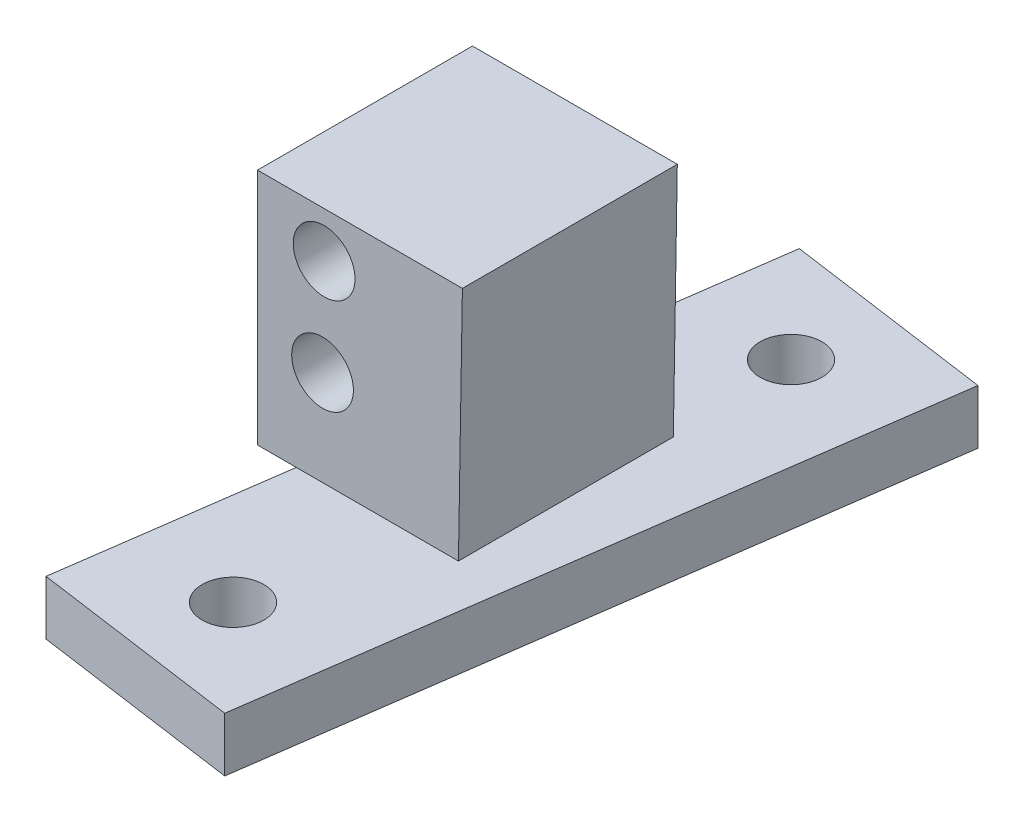
ISO-10303-21;
HEADER;
FILE_DESCRIPTION(('STEP AP214'),'2;1');
FILE_NAME('part.step','',(''),(''),'','','');
FILE_SCHEMA(('AUTOMOTIVE_DESIGN { 1 0 10303 214 1 1 1 1 }'));
ENDSEC;
DATA;
#1=APPLICATION_CONTEXT('core data for automotive mechanical design processes');
#2=APPLICATION_PROTOCOL_DEFINITION('international standard','automotive_design',2000,#1);
#3=PRODUCT_CONTEXT('',#1,'mechanical');
#4=PRODUCT('Part','Part','',(#3));
#5=PRODUCT_RELATED_PRODUCT_CATEGORY('part','',(#4));
#6=PRODUCT_DEFINITION_FORMATION('','',#4);
#7=PRODUCT_DEFINITION_CONTEXT('part definition',#1,'design');
#8=PRODUCT_DEFINITION('design','',#6,#7);
#9=PRODUCT_DEFINITION_SHAPE('','',#8);
#10=(LENGTH_UNIT() NAMED_UNIT(*) SI_UNIT(.MILLI.,.METRE.));
#11=(NAMED_UNIT(*) PLANE_ANGLE_UNIT() SI_UNIT($,.RADIAN.));
#12=(NAMED_UNIT(*) SI_UNIT($,.STERADIAN.) SOLID_ANGLE_UNIT());
#13=UNCERTAINTY_MEASURE_WITH_UNIT(LENGTH_MEASURE(1.E-05),#10,'distance_accuracy_value','');
#14=(GEOMETRIC_REPRESENTATION_CONTEXT(3) GLOBAL_UNCERTAINTY_ASSIGNED_CONTEXT((#13)) GLOBAL_UNIT_ASSIGNED_CONTEXT((#10,
#11,#12)) REPRESENTATION_CONTEXT('',''));
#15=CARTESIAN_POINT('',(0.,0.,0.));
#16=DIRECTION('',(0.,0.,1.));
#17=DIRECTION('',(1.,0.,0.));
#18=AXIS2_PLACEMENT_3D('',#15,#16,#17);
#19=CARTESIAN_POINT('',(0.,110.70207067776,54.397912950041));
#20=DIRECTION('',(0.,-1.,0.));
#21=DIRECTION('',(0.,0.,-1.));
#22=AXIS2_PLACEMENT_3D('',#19,#20,#21);
#23=PLANE('',#22);
#24=DIRECTION('',(-1.,0.,0.));
#25=VECTOR('',#24,1.);
#26=CARTESIAN_POINT('',(0.,110.70207067776,0.));
#27=LINE('',#26,#25);
#28=CARTESIAN_POINT('',(437.572544129131,110.70207067776,0.));
#29=VERTEX_POINT('',#28);
#30=CARTESIAN_POINT('',(430.481837090521,110.70207067776,0.));
#31=VERTEX_POINT('',#30);
#32=EDGE_CURVE('E120',#29,#31,#27,.T.);
#33=ORIENTED_EDGE('',*,*,#32,.F.);
#34=DIRECTION('',(-0.139173100960062,0.,0.990268068741571));
#35=VECTOR('',#34,1.);
#36=CARTESIAN_POINT('',(431.295573301546,110.70207067776,44.6629681748933));
#37=LINE('',#36,#35);
#38=CARTESIAN_POINT('',(434.466872763878,110.70207067776,22.0979999999998));
#39=VERTEX_POINT('',#38);
#40=EDGE_CURVE('E11',#29,#39,#37,.T.);
#41=ORIENTED_EDGE('',*,*,#40,.T.);
#42=DIRECTION('',(1.,0.,0.));
#43=VECTOR('',#42,1.);
#44=CARTESIAN_POINT('',(0.,110.70207067776,22.0979999999998));
#45=LINE('',#44,#43);
#46=CARTESIAN_POINT('',(430.481837090521,110.70207067776,22.0979999999998));
#47=VERTEX_POINT('',#46);
#48=EDGE_CURVE('E152',#47,#39,#45,.T.);
#49=ORIENTED_EDGE('',*,*,#48,.F.);
#50=DIRECTION('',(0.,0.,-1.));
#51=VECTOR('',#50,1.);
#52=CARTESIAN_POINT('',(430.481837090521,110.70207067776,54.397912950041));
#53=LINE('',#52,#51);
#54=EDGE_CURVE('E102',#47,#31,#53,.T.);
#55=ORIENTED_EDGE('',*,*,#54,.T.);
#56=EDGE_LOOP('',(#33,#41,#49,#55));
#57=FACE_BOUND('',#56,.T.);
#58=ADVANCED_FACE('F47',(#57),#23,.T.);
#59=CARTESIAN_POINT('',(0.,135.188251434978,54.397912950041));
#60=DIRECTION('',(0.,1.,0.));
#61=DIRECTION('',(0.,0.,1.));
#62=AXIS2_PLACEMENT_3D('',#59,#60,#61);
#63=PLANE('',#62);
#64=DIRECTION('',(-1.,0.,0.));
#65=VECTOR('',#64,1.);
#66=CARTESIAN_POINT('',(0.,135.188251434978,22.0979999999998));
#67=LINE('',#66,#65);
#68=CARTESIAN_POINT('',(451.546293611045,135.188251434978,22.0979999999998));
#69=VERTEX_POINT('',#68);
#70=CARTESIAN_POINT('',(430.481837090521,135.188251434978,22.0979999999998));
#71=VERTEX_POINT('',#70);
#72=EDGE_CURVE('E146',#69,#71,#67,.T.);
#73=ORIENTED_EDGE('',*,*,#72,.F.);
#74=DIRECTION('',(0.,0.,-1.));
#75=VECTOR('',#74,1.);
#76=CARTESIAN_POINT('',(451.546293611045,135.188251434978,54.397912950041));
#77=LINE('',#76,#75);
#78=CARTESIAN_POINT('',(451.546293611045,135.188251434978,0.));
#79=VERTEX_POINT('',#78);
#80=EDGE_CURVE('E103',#69,#79,#77,.T.);
#81=ORIENTED_EDGE('',*,*,#80,.T.);
#82=DIRECTION('',(1.,0.,0.));
#83=VECTOR('',#82,1.);
#84=CARTESIAN_POINT('',(0.,135.188251434978,0.));
#85=LINE('',#84,#83);
#86=CARTESIAN_POINT('',(430.481837090521,135.188251434978,0.));
#87=VERTEX_POINT('',#86);
#88=EDGE_CURVE('E106',#87,#79,#85,.T.);
#89=ORIENTED_EDGE('',*,*,#88,.F.);
#90=DIRECTION('',(0.,0.,-1.));
#91=VECTOR('',#90,1.);
#92=CARTESIAN_POINT('',(430.481837090521,135.188251434978,54.397912950041));
#93=LINE('',#92,#91);
#94=EDGE_CURVE('E93',#71,#87,#93,.T.);
#95=ORIENTED_EDGE('',*,*,#94,.F.);
#96=EDGE_LOOP('',(#73,#81,#89,#95));
#97=FACE_BOUND('',#96,.T.);
#98=ADVANCED_FACE('F107',(#97),#63,.T.);
#99=CARTESIAN_POINT('',(430.481837090521,0.,54.397912950041));
#100=DIRECTION('',(-1.,0.,0.));
#101=DIRECTION('',(0.,0.,1.));
#102=AXIS2_PLACEMENT_3D('',#99,#100,#101);
#103=PLANE('',#102);
#104=DIRECTION('',(0.,-1.,0.));
#105=VECTOR('',#104,1.);
#106=CARTESIAN_POINT('',(430.481837090521,0.,22.0979999999998));
#107=LINE('',#106,#105);
#108=EDGE_CURVE('E99',#71,#47,#107,.T.);
#109=ORIENTED_EDGE('',*,*,#108,.F.);
#110=ORIENTED_EDGE('',*,*,#94,.T.);
#111=DIRECTION('',(0.,1.,0.));
#112=VECTOR('',#111,1.);
#113=CARTESIAN_POINT('',(430.481837090521,0.,0.));
#114=LINE('',#113,#112);
#115=EDGE_CURVE('E98',#31,#87,#114,.T.);
#116=ORIENTED_EDGE('',*,*,#115,.F.);
#117=ORIENTED_EDGE('',*,*,#54,.F.);
#118=EDGE_LOOP('',(#109,#110,#116,#117));
#119=FACE_BOUND('',#118,.T.);
#120=ADVANCED_FACE('F95',(#119),#103,.T.);
#121=CARTESIAN_POINT('',(437.164813365978,120.500000000002,54.397912950041));
#122=DIRECTION('',(0.,0.,-1.));
#123=DIRECTION('',(-1.,0.,0.));
#124=AXIS2_PLACEMENT_3D('',#121,#122,#123);
#125=CYLINDRICAL_SURFACE('',#124,3.17500000000002);
#126=CARTESIAN_POINT('',(437.164813365978,120.500000000002,22.0979999999998));
#127=DIRECTION('',(0.,0.,-1.));
#128=DIRECTION('',(-1.,0.,0.));
#129=AXIS2_PLACEMENT_3D('',#126,#127,#128);
#130=CIRCLE('',#129,3.17500000000002);
#131=CARTESIAN_POINT('',(433.989813365978,120.500000000002,22.0979999999998));
#132=VERTEX_POINT('',#131);
#133=EDGE_CURVE('E142',#132,#132,#130,.T.);
#134=ORIENTED_EDGE('',*,*,#133,.F.);
#135=EDGE_LOOP('',(#134));
#136=FACE_BOUND('',#135,.T.);
#137=CARTESIAN_POINT('',(437.164813365978,120.500000000002,0.));
#138=DIRECTION('',(0.,0.,1.));
#139=DIRECTION('',(1.,0.,0.));
#140=AXIS2_PLACEMENT_3D('',#137,#138,#139);
#141=CIRCLE('',#140,3.17500000000002);
#142=CARTESIAN_POINT('',(440.339813365979,120.500000000002,0.));
#143=VERTEX_POINT('',#142);
#144=EDGE_CURVE('E123',#143,#143,#141,.T.);
#145=ORIENTED_EDGE('',*,*,#144,.F.);
#146=EDGE_LOOP('',(#145));
#147=FACE_BOUND('',#146,.T.);
#148=ADVANCED_FACE('F315',(#136,#147),#125,.F.);
#149=CARTESIAN_POINT('',(449.174121077904,-7.46907661315017,54.397912950041));
#150=DIRECTION('',(0.999861775722981,-0.0166261675706381,0.));
#151=DIRECTION('',(0.0166261675706381,0.999861775722981,0.));
#152=AXIS2_PLACEMENT_3D('',#149,#150,#151);
#153=PLANE('',#152);
#154=DIRECTION('',(0.0166261675706381,0.999861775722981,0.));
#155=VECTOR('',#154,1.);
#156=CARTESIAN_POINT('',(449.174121077904,-7.46907661315017,22.0979999999998));
#157=LINE('',#156,#155);
#158=CARTESIAN_POINT('',(451.13912598616,110.70207067776,22.0979999999999));
#159=VERTEX_POINT('',#158);
#160=EDGE_CURVE('E74',#159,#69,#157,.T.);
#161=ORIENTED_EDGE('',*,*,#160,.F.);
#162=DIRECTION('',(0.,0.,-1.));
#163=VECTOR('',#162,1.);
#164=CARTESIAN_POINT('',(451.13912598616,110.70207067776,54.397912950041));
#165=LINE('',#164,#163);
#166=CARTESIAN_POINT('',(451.13912598616,110.70207067776,0.));
#167=VERTEX_POINT('',#166);
#168=EDGE_CURVE('E114',#159,#167,#165,.T.);
#169=ORIENTED_EDGE('',*,*,#168,.T.);
#170=DIRECTION('',(-0.0166261675706381,-0.999861775722981,0.));
#171=VECTOR('',#170,1.);
#172=CARTESIAN_POINT('',(449.174121077904,-7.46907661315017,0.));
#173=LINE('',#172,#171);
#174=EDGE_CURVE('E113',#79,#167,#173,.T.);
#175=ORIENTED_EDGE('',*,*,#174,.F.);
#176=ORIENTED_EDGE('',*,*,#80,.F.);
#177=EDGE_LOOP('',(#161,#169,#175,#176));
#178=FACE_BOUND('',#177,.T.);
#179=ADVANCED_FACE('F164',(#178),#153,.T.);
#180=CARTESIAN_POINT('',(437.331098026262,130.500000000002,54.397912950041));
#181=DIRECTION('',(0.,0.,-1.));
#182=DIRECTION('',(-1.,0.,0.));
#183=AXIS2_PLACEMENT_3D('',#180,#181,#182);
#184=CYLINDRICAL_SURFACE('',#183,3.17499999999997);
#185=CARTESIAN_POINT('',(437.331098026262,130.500000000002,22.0979999999998));
#186=DIRECTION('',(0.,0.,-1.));
#187=DIRECTION('',(-1.,0.,0.));
#188=AXIS2_PLACEMENT_3D('',#185,#186,#187);
#189=CIRCLE('',#188,3.17499999999997);
#190=CARTESIAN_POINT('',(434.156098026262,130.500000000002,22.0979999999998));
#191=VERTEX_POINT('',#190);
#192=EDGE_CURVE('E51',#191,#191,#189,.T.);
#193=ORIENTED_EDGE('',*,*,#192,.F.);
#194=EDGE_LOOP('',(#193));
#195=FACE_BOUND('',#194,.T.);
#196=CARTESIAN_POINT('',(437.331098026262,130.500000000002,0.));
#197=DIRECTION('',(0.,0.,1.));
#198=DIRECTION('',(1.,0.,0.));
#199=AXIS2_PLACEMENT_3D('',#196,#197,#198);
#200=CIRCLE('',#199,3.17499999999997);
#201=CARTESIAN_POINT('',(440.506098026262,130.500000000002,0.));
#202=VERTEX_POINT('',#201);
#203=EDGE_CURVE('E129',#202,#202,#200,.T.);
#204=ORIENTED_EDGE('',*,*,#203,.F.);
#205=EDGE_LOOP('',(#204));
#206=FACE_BOUND('',#205,.T.);
#207=ADVANCED_FACE('F161',(#195,#206),#184,.F.);
#208=CARTESIAN_POINT('',(0.,0.,0.));
#209=DIRECTION('',(0.,0.,1.));
#210=DIRECTION('',(1.,0.,0.));
#211=AXIS2_PLACEMENT_3D('',#208,#209,#210);
#212=PLANE('',#211);
#213=ORIENTED_EDGE('',*,*,#88,.T.);
#214=ORIENTED_EDGE('',*,*,#174,.T.);
#215=EDGE_CURVE('E124',#167,#29,#27,.T.);
#216=ORIENTED_EDGE('',*,*,#215,.T.);
#217=ORIENTED_EDGE('',*,*,#32,.T.);
#218=ORIENTED_EDGE('',*,*,#115,.T.);
#219=EDGE_LOOP('',(#213,#214,#216,#217,#218));
#220=FACE_BOUND('',#219,.T.);
#221=ORIENTED_EDGE('',*,*,#144,.T.);
#222=EDGE_LOOP('',(#221));
#223=FACE_BOUND('',#222,.T.);
#224=ORIENTED_EDGE('',*,*,#203,.T.);
#225=EDGE_LOOP('',(#224));
#226=FACE_BOUND('',#225,.T.);
#227=ADVANCED_FACE('F116',(#220,#223,#226),#212,.F.);
#228=CARTESIAN_POINT('',(405.259993131351,116.453404428401,22.0979999999998));
#229=DIRECTION('',(0.,0.,-1.));
#230=DIRECTION('',(-1.,0.,0.));
#231=AXIS2_PLACEMENT_3D('',#228,#229,#230);
#232=PLANE('',#231);
#233=ORIENTED_EDGE('',*,*,#133,.T.);
#234=EDGE_LOOP('',(#233));
#235=FACE_BOUND('',#234,.T.);
#236=ORIENTED_EDGE('',*,*,#72,.T.);
#237=ORIENTED_EDGE('',*,*,#108,.T.);
#238=ORIENTED_EDGE('',*,*,#48,.T.);
#239=EDGE_CURVE('E151',#39,#159,#45,.T.);
#240=ORIENTED_EDGE('',*,*,#239,.T.);
#241=ORIENTED_EDGE('',*,*,#160,.T.);
#242=EDGE_LOOP('',(#236,#237,#238,#240,#241));
#243=FACE_BOUND('',#242,.T.);
#244=ORIENTED_EDGE('',*,*,#192,.T.);
#245=EDGE_LOOP('',(#244));
#246=FACE_BOUND('',#245,.T.);
#247=ADVANCED_FACE('F49',(#235,#243,#246),#232,.F.);
#248=CARTESIAN_POINT('',(452.675460905676,105.11407067776,47.667715424621));
#249=DIRECTION('',(-0.139173100960062,0.,0.990268068741571));
#250=DIRECTION('',(0.990268068741571,0.,0.139173100960062));
#251=AXIS2_PLACEMENT_3D('',#248,#249,#250);
#252=PLANE('',#251);
#253=DIRECTION('',(0.990268068741571,0.,0.139173100960062));
#254=VECTOR('',#253,1.);
#255=CARTESIAN_POINT('',(452.675460905676,110.70207067776,47.667715424621));
#256=LINE('',#255,#254);
#257=CARTESIAN_POINT('',(431.295573301546,110.70207067776,44.6629681748933));
#258=VERTEX_POINT('',#257);
#259=CARTESIAN_POINT('',(452.675460905676,110.70207067776,47.667715424621));
#260=VERTEX_POINT('',#259);
#261=EDGE_CURVE('E239',#258,#260,#256,.T.);
#262=ORIENTED_EDGE('',*,*,#261,.F.);
#263=DIRECTION('',(0.,1.,0.));
#264=VECTOR('',#263,1.);
#265=CARTESIAN_POINT('',(431.295573301546,105.11407067776,44.6629681748933));
#266=LINE('',#265,#264);
#267=CARTESIAN_POINT('',(431.295573301546,105.11407067776,44.6629681748933));
#268=VERTEX_POINT('',#267);
#269=EDGE_CURVE('E141',#268,#258,#266,.T.);
#270=ORIENTED_EDGE('',*,*,#269,.F.);
#271=DIRECTION('',(0.990268068741571,0.,0.139173100960062));
#272=VECTOR('',#271,1.);
#273=CARTESIAN_POINT('',(452.675460905676,105.11407067776,47.667715424621));
#274=LINE('',#273,#272);
#275=CARTESIAN_POINT('',(452.675460905676,105.11407067776,47.667715424621));
#276=VERTEX_POINT('',#275);
#277=EDGE_CURVE('E200',#268,#276,#274,.T.);
#278=ORIENTED_EDGE('',*,*,#277,.T.);
#279=DIRECTION('',(0.,1.,0.));
#280=VECTOR('',#279,1.);
#281=CARTESIAN_POINT('',(452.675460905676,105.11407067776,47.667715424621));
#282=LINE('',#281,#280);
#283=EDGE_CURVE('E171',#276,#260,#282,.T.);
#284=ORIENTED_EDGE('',*,*,#283,.T.);
#285=EDGE_LOOP('',(#262,#270,#278,#284));
#286=FACE_BOUND('',#285,.T.);
#287=ADVANCED_FACE('F262',(#286),#252,.T.);
#288=CARTESIAN_POINT('',(431.295573301546,105.11407067776,44.6629681748933));
#289=DIRECTION('',(-0.990268068741571,0.,-0.139173100960062));
#290=DIRECTION('',(-0.139173100960062,0.,0.990268068741571));
#291=AXIS2_PLACEMENT_3D('',#288,#289,#290);
#292=PLANE('',#291);
#293=CARTESIAN_POINT('',(440.840064565387,110.70207067776,-23.2496159794036));
#294=VERTEX_POINT('',#293);
#295=EDGE_CURVE('E58',#294,#29,#37,.T.);
#296=ORIENTED_EDGE('',*,*,#295,.F.);
#297=DIRECTION('',(0.,1.,0.));
#298=VECTOR('',#297,1.);
#299=CARTESIAN_POINT('',(440.840064565387,105.11407067776,-23.2496159794037));
#300=LINE('',#299,#298);
#301=CARTESIAN_POINT('',(440.840064565387,105.11407067776,-23.2496159794037));
#302=VERTEX_POINT('',#301);
#303=EDGE_CURVE('E211',#302,#294,#300,.T.);
#304=ORIENTED_EDGE('',*,*,#303,.F.);
#305=DIRECTION('',(-0.139173100960062,0.,0.990268068741571));
#306=VECTOR('',#305,1.);
#307=CARTESIAN_POINT('',(431.295573301546,105.11407067776,44.6629681748933));
#308=LINE('',#307,#306);
#309=EDGE_CURVE('E224',#302,#268,#308,.T.);
#310=ORIENTED_EDGE('',*,*,#309,.T.);
#311=ORIENTED_EDGE('',*,*,#269,.T.);
#312=EDGE_CURVE('E59',#39,#258,#37,.T.);
#313=ORIENTED_EDGE('',*,*,#312,.F.);
#314=ORIENTED_EDGE('',*,*,#40,.F.);
#315=EDGE_LOOP('',(#296,#304,#310,#311,#313,#314));
#316=FACE_BOUND('',#315,.T.);
#317=ADVANCED_FACE('F190',(#316),#292,.T.);
#318=CARTESIAN_POINT('',(440.840064565387,105.11407067776,-23.2496159794037));
#319=DIRECTION('',(0.139173100960062,0.,-0.990268068741571));
#320=DIRECTION('',(-0.990268068741571,0.,-0.139173100960062));
#321=AXIS2_PLACEMENT_3D('',#318,#319,#320);
#322=PLANE('',#321);
#323=DIRECTION('',(-0.990268068741571,0.,-0.139173100960062));
#324=VECTOR('',#323,1.);
#325=CARTESIAN_POINT('',(440.840064565387,110.70207067776,-23.2496159794036));
#326=LINE('',#325,#324);
#327=CARTESIAN_POINT('',(462.219952169517,110.70207067776,-20.2448687296759));
#328=VERTEX_POINT('',#327);
#329=EDGE_CURVE('E198',#328,#294,#326,.T.);
#330=ORIENTED_EDGE('',*,*,#329,.F.);
#331=DIRECTION('',(0.,1.,0.));
#332=VECTOR('',#331,1.);
#333=CARTESIAN_POINT('',(462.219952169517,105.11407067776,-20.2448687296759));
#334=LINE('',#333,#332);
#335=CARTESIAN_POINT('',(462.219952169517,105.11407067776,-20.2448687296759));
#336=VERTEX_POINT('',#335);
#337=EDGE_CURVE('E214',#336,#328,#334,.T.);
#338=ORIENTED_EDGE('',*,*,#337,.F.);
#339=DIRECTION('',(-0.990268068741571,0.,-0.139173100960062));
#340=VECTOR('',#339,1.);
#341=CARTESIAN_POINT('',(440.840064565387,105.11407067776,-23.2496159794037));
#342=LINE('',#341,#340);
#343=EDGE_CURVE('E231',#336,#302,#342,.T.);
#344=ORIENTED_EDGE('',*,*,#343,.T.);
#345=ORIENTED_EDGE('',*,*,#303,.T.);
#346=EDGE_LOOP('',(#330,#338,#344,#345));
#347=FACE_BOUND('',#346,.T.);
#348=ADVANCED_FACE('F331',(#347),#322,.T.);
#349=CARTESIAN_POINT('',(462.219952169517,105.11407067776,-20.2448687296759));
#350=DIRECTION('',(0.990268068741571,0.,0.139173100960062));
#351=DIRECTION('',(0.139173100960062,0.,-0.990268068741571));
#352=AXIS2_PLACEMENT_3D('',#349,#350,#351);
#353=PLANE('',#352);
#354=DIRECTION('',(0.139173100960062,0.,-0.990268068741571));
#355=VECTOR('',#354,1.);
#356=CARTESIAN_POINT('',(462.219952169517,110.70207067776,-20.2448687296759));
#357=LINE('',#356,#355);
#358=EDGE_CURVE('E242',#260,#328,#357,.T.);
#359=ORIENTED_EDGE('',*,*,#358,.F.);
#360=ORIENTED_EDGE('',*,*,#283,.F.);
#361=DIRECTION('',(0.139173100960062,0.,-0.990268068741571));
#362=VECTOR('',#361,1.);
#363=CARTESIAN_POINT('',(462.219952169517,105.11407067776,-20.2448687296759));
#364=LINE('',#363,#362);
#365=EDGE_CURVE('E204',#276,#336,#364,.T.);
#366=ORIENTED_EDGE('',*,*,#365,.T.);
#367=ORIENTED_EDGE('',*,*,#337,.T.);
#368=EDGE_LOOP('',(#359,#360,#366,#367));
#369=FACE_BOUND('',#368,.T.);
#370=ADVANCED_FACE('F247',(#369),#353,.T.);
#371=CARTESIAN_POINT('',(0.,105.11407067776,2.22420850470832E-13));
#372=DIRECTION('',(0.,-1.,0.));
#373=DIRECTION('',(0.,0.,-1.));
#374=AXIS2_PLACEMENT_3D('',#371,#372,#373);
#375=PLANE('',#374);
#376=CARTESIAN_POINT('',(450.292759499917,105.11407067776,-12.9437592234272));
#377=DIRECTION('',(0.,1.,0.));
#378=DIRECTION('',(0.,0.,1.));
#379=AXIS2_PLACEMENT_3D('',#376,#377,#378);
#380=CIRCLE('',#379,3.17499999999997);
#381=CARTESIAN_POINT('',(450.292759499917,105.11407067776,-9.76875922342726));
#382=VERTEX_POINT('',#381);
#383=EDGE_CURVE('E272',#382,#382,#380,.T.);
#384=ORIENTED_EDGE('',*,*,#383,.T.);
#385=EDGE_LOOP('',(#384));
#386=FACE_BOUND('',#385,.T.);
#387=CARTESIAN_POINT('',(443.222765971146,105.11407067776,37.3618586686446));
#388=DIRECTION('',(0.,1.,0.));
#389=DIRECTION('',(0.,0.,1.));
#390=AXIS2_PLACEMENT_3D('',#387,#388,#389);
#391=CIRCLE('',#390,3.17499999999997);
#392=CARTESIAN_POINT('',(443.222765971146,105.11407067776,40.5368586686445));
#393=VERTEX_POINT('',#392);
#394=EDGE_CURVE('E243',#393,#393,#391,.T.);
#395=ORIENTED_EDGE('',*,*,#394,.T.);
#396=EDGE_LOOP('',(#395));
#397=FACE_BOUND('',#396,.T.);
#398=ORIENTED_EDGE('',*,*,#277,.F.);
#399=ORIENTED_EDGE('',*,*,#309,.F.);
#400=ORIENTED_EDGE('',*,*,#343,.F.);
#401=ORIENTED_EDGE('',*,*,#365,.F.);
#402=EDGE_LOOP('',(#398,#399,#400,#401));
#403=FACE_BOUND('',#402,.T.);
#404=ADVANCED_FACE('F264',(#386,#397,#403),#375,.T.);
#405=CARTESIAN_POINT('',(-1.04760091776986E-13,110.70207067776,2.34115911380723E-13));
#406=DIRECTION('',(0.,-1.,0.));
#407=DIRECTION('',(0.,0.,-1.));
#408=AXIS2_PLACEMENT_3D('',#405,#406,#407);
#409=PLANE('',#408);
#410=ORIENTED_EDGE('',*,*,#239,.F.);
#411=ORIENTED_EDGE('',*,*,#312,.T.);
#412=ORIENTED_EDGE('',*,*,#261,.T.);
#413=ORIENTED_EDGE('',*,*,#358,.T.);
#414=ORIENTED_EDGE('',*,*,#329,.T.);
#415=ORIENTED_EDGE('',*,*,#295,.T.);
#416=ORIENTED_EDGE('',*,*,#215,.F.);
#417=ORIENTED_EDGE('',*,*,#168,.F.);
#418=EDGE_LOOP('',(#410,#411,#412,#413,#414,#415,#416,#417));
#419=FACE_BOUND('',#418,.T.);
#420=CARTESIAN_POINT('',(450.292759499917,110.70207067776,-12.9437592234272));
#421=DIRECTION('',(0.,1.,0.));
#422=DIRECTION('',(0.,0.,1.));
#423=AXIS2_PLACEMENT_3D('',#420,#421,#422);
#424=CIRCLE('',#423,3.17499999999997);
#425=CARTESIAN_POINT('',(450.292759499917,110.70207067776,-9.76875922342725));
#426=VERTEX_POINT('',#425);
#427=EDGE_CURVE('E276',#426,#426,#424,.T.);
#428=ORIENTED_EDGE('',*,*,#427,.F.);
#429=EDGE_LOOP('',(#428));
#430=FACE_BOUND('',#429,.T.);
#431=CARTESIAN_POINT('',(443.222765971146,110.70207067776,37.3618586686446));
#432=DIRECTION('',(0.,1.,0.));
#433=DIRECTION('',(0.,0.,1.));
#434=AXIS2_PLACEMENT_3D('',#431,#432,#433);
#435=CIRCLE('',#434,3.17499999999997);
#436=CARTESIAN_POINT('',(443.222765971146,110.70207067776,40.5368586686445));
#437=VERTEX_POINT('',#436);
#438=EDGE_CURVE('E268',#437,#437,#435,.T.);
#439=ORIENTED_EDGE('',*,*,#438,.F.);
#440=EDGE_LOOP('',(#439));
#441=FACE_BOUND('',#440,.T.);
#442=ADVANCED_FACE('F182',(#419,#430,#441),#409,.F.);
#443=CARTESIAN_POINT('',(443.222765971146,105.11407067776,37.3618586686446));
#444=DIRECTION('',(0.,1.,0.));
#445=DIRECTION('',(0.,0.,1.));
#446=AXIS2_PLACEMENT_3D('',#443,#444,#445);
#447=CYLINDRICAL_SURFACE('',#446,3.17499999999997);
#448=ORIENTED_EDGE('',*,*,#394,.F.);
#449=EDGE_LOOP('',(#448));
#450=FACE_BOUND('',#449,.T.);
#451=ORIENTED_EDGE('',*,*,#438,.T.);
#452=EDGE_LOOP('',(#451));
#453=FACE_BOUND('',#452,.T.);
#454=ADVANCED_FACE('F289',(#450,#453),#447,.F.);
#455=CARTESIAN_POINT('',(450.292759499917,105.11407067776,-12.9437592234272));
#456=DIRECTION('',(0.,1.,0.));
#457=DIRECTION('',(0.,0.,1.));
#458=AXIS2_PLACEMENT_3D('',#455,#456,#457);
#459=CYLINDRICAL_SURFACE('',#458,3.17499999999997);
#460=ORIENTED_EDGE('',*,*,#383,.F.);
#461=EDGE_LOOP('',(#460));
#462=FACE_BOUND('',#461,.T.);
#463=ORIENTED_EDGE('',*,*,#427,.T.);
#464=EDGE_LOOP('',(#463));
#465=FACE_BOUND('',#464,.T.);
#466=ADVANCED_FACE('F286',(#462,#465),#459,.F.);
#467=CLOSED_SHELL('',(#58,#98,#120,#148,#179,#207,#227,#247,#287,#317,#348,#370,#404,#442,#454,#466));
#468=MANIFOLD_SOLID_BREP('B2',#467);
#469=ADVANCED_BREP_SHAPE_REPRESENTATION('',(#18,#468),#14);
#470=SHAPE_DEFINITION_REPRESENTATION(#9,#469);
ENDSEC;
END-ISO-10303-21;
